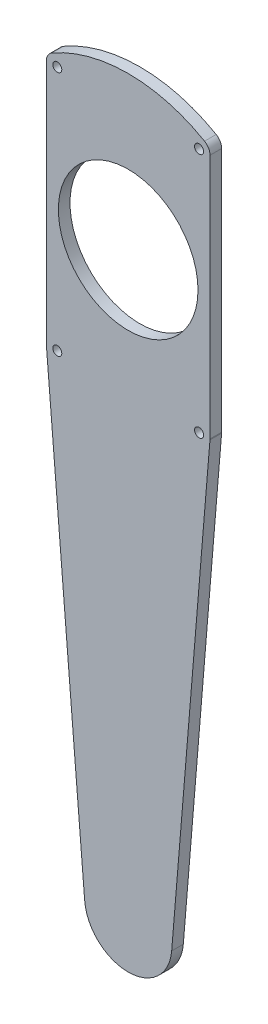
ISO-10303-21;
HEADER;
FILE_DESCRIPTION(('STEP AP214'),'2;1');
FILE_NAME('part.step','',(''),(''),'','','');
FILE_SCHEMA(('AUTOMOTIVE_DESIGN { 1 0 10303 214 1 1 1 1 }'));
ENDSEC;
DATA;
#1=APPLICATION_CONTEXT('core data for automotive mechanical design processes');
#2=APPLICATION_PROTOCOL_DEFINITION('international standard','automotive_design',2000,#1);
#3=PRODUCT_CONTEXT('',#1,'mechanical');
#4=PRODUCT('Part','Part','',(#3));
#5=PRODUCT_RELATED_PRODUCT_CATEGORY('part','',(#4));
#6=PRODUCT_DEFINITION_FORMATION('','',#4);
#7=PRODUCT_DEFINITION_CONTEXT('part definition',#1,'design');
#8=PRODUCT_DEFINITION('design','',#6,#7);
#9=PRODUCT_DEFINITION_SHAPE('','',#8);
#10=(LENGTH_UNIT() NAMED_UNIT(*) SI_UNIT(.MILLI.,.METRE.));
#11=(NAMED_UNIT(*) PLANE_ANGLE_UNIT() SI_UNIT($,.RADIAN.));
#12=(NAMED_UNIT(*) SI_UNIT($,.STERADIAN.) SOLID_ANGLE_UNIT());
#13=UNCERTAINTY_MEASURE_WITH_UNIT(LENGTH_MEASURE(1.E-05),#10,'distance_accuracy_value','');
#14=(GEOMETRIC_REPRESENTATION_CONTEXT(3) GLOBAL_UNCERTAINTY_ASSIGNED_CONTEXT((#13)) GLOBAL_UNIT_ASSIGNED_CONTEXT((#10,
#11,#12)) REPRESENTATION_CONTEXT('',''));
#15=CARTESIAN_POINT('',(0.,0.,0.));
#16=DIRECTION('',(0.,0.,1.));
#17=DIRECTION('',(1.,0.,0.));
#18=AXIS2_PLACEMENT_3D('',#15,#16,#17);
#19=CARTESIAN_POINT('',(-24.375,-42.2187384344914,4.));
#20=DIRECTION('',(0.,0.,-1.));
#21=DIRECTION('',(-1.,0.,0.));
#22=AXIS2_PLACEMENT_3D('',#19,#20,#21);
#23=CYLINDRICAL_SURFACE('',#22,3.74999999999996);
#24=DIRECTION('',(0.,0.,-1.));
#25=VECTOR('',#24,1.);
#26=CARTESIAN_POINT('',(-28.1121679714558,-42.5286990015384,4.));
#27=LINE('',#26,#25);
#28=CARTESIAN_POINT('',(-28.1121679714559,-42.5286990015384,4.));
#29=VERTEX_POINT('',#28);
#30=CARTESIAN_POINT('',(-28.1121679714559,-42.5286990015384,0.));
#31=VERTEX_POINT('',#30);
#32=EDGE_CURVE('E58',#29,#31,#27,.T.);
#33=ORIENTED_EDGE('',*,*,#32,.F.);
#34=CARTESIAN_POINT('',(-24.375,-42.2187384344914,4.));
#35=DIRECTION('',(0.,0.,1.));
#36=DIRECTION('',(1.,0.,0.));
#37=AXIS2_PLACEMENT_3D('',#34,#35,#36);
#38=CIRCLE('',#37,3.74999999999996);
#39=CARTESIAN_POINT('',(-28.125,-42.2187384344914,4.));
#40=VERTEX_POINT('',#39);
#41=EDGE_CURVE('E129',#40,#29,#38,.T.);
#42=ORIENTED_EDGE('',*,*,#41,.F.);
#43=DIRECTION('',(0.,0.,-1.));
#44=VECTOR('',#43,1.);
#45=CARTESIAN_POINT('',(-28.125,-42.2187384344914,4.));
#46=LINE('',#45,#44);
#47=CARTESIAN_POINT('',(-28.125,-42.2187384344914,0.));
#48=VERTEX_POINT('',#47);
#49=EDGE_CURVE('E202',#40,#48,#46,.T.);
#50=ORIENTED_EDGE('',*,*,#49,.T.);
#51=CARTESIAN_POINT('',(-24.375,-42.2187384344914,0.));
#52=DIRECTION('',(0.,0.,1.));
#53=DIRECTION('',(1.,0.,0.));
#54=AXIS2_PLACEMENT_3D('',#51,#52,#53);
#55=CIRCLE('',#54,3.74999999999996);
#56=EDGE_CURVE('E182',#48,#31,#55,.T.);
#57=ORIENTED_EDGE('',*,*,#56,.T.);
#58=EDGE_LOOP('',(#33,#42,#50,#57));
#59=FACE_BOUND('',#58,.T.);
#60=ADVANCED_FACE('F35',(#59),#23,.T.);
#61=CARTESIAN_POINT('',(28.125,0.,4.));
#62=DIRECTION('',(1.,0.,0.));
#63=DIRECTION('',(0.,1.,0.));
#64=AXIS2_PLACEMENT_3D('',#61,#62,#63);
#65=PLANE('',#64);
#66=DIRECTION('',(0.,-1.,0.));
#67=VECTOR('',#66,1.);
#68=CARTESIAN_POINT('',(28.125,0.,0.));
#69=LINE('',#68,#67);
#70=CARTESIAN_POINT('',(28.125,42.2187384344914,0.));
#71=VERTEX_POINT('',#70);
#72=CARTESIAN_POINT('',(28.125,-42.2187384344914,0.));
#73=VERTEX_POINT('',#72);
#74=EDGE_CURVE('E136',#71,#73,#69,.T.);
#75=ORIENTED_EDGE('',*,*,#74,.F.);
#76=DIRECTION('',(0.,0.,-1.));
#77=VECTOR('',#76,1.);
#78=CARTESIAN_POINT('',(28.125,42.2187384344914,4.));
#79=LINE('',#78,#77);
#80=CARTESIAN_POINT('',(28.125,42.2187384344914,4.));
#81=VERTEX_POINT('',#80);
#82=EDGE_CURVE('E11',#81,#71,#79,.T.);
#83=ORIENTED_EDGE('',*,*,#82,.F.);
#84=DIRECTION('',(0.,-1.,0.));
#85=VECTOR('',#84,1.);
#86=CARTESIAN_POINT('',(28.125,0.,4.));
#87=LINE('',#86,#85);
#88=CARTESIAN_POINT('',(28.125,-42.2187384344914,4.));
#89=VERTEX_POINT('',#88);
#90=EDGE_CURVE('E145',#81,#89,#87,.T.);
#91=ORIENTED_EDGE('',*,*,#90,.T.);
#92=DIRECTION('',(0.,0.,-1.));
#93=VECTOR('',#92,1.);
#94=CARTESIAN_POINT('',(28.125,-42.2187384344914,4.));
#95=LINE('',#94,#93);
#96=EDGE_CURVE('E173',#89,#73,#95,.T.);
#97=ORIENTED_EDGE('',*,*,#96,.T.);
#98=EDGE_LOOP('',(#75,#83,#91,#97));
#99=FACE_BOUND('',#98,.T.);
#100=ADVANCED_FACE('F37',(#99),#65,.T.);
#101=CARTESIAN_POINT('',(24.375,42.2187384344914,4.));
#102=DIRECTION('',(0.,0.,-1.));
#103=DIRECTION('',(-1.,0.,0.));
#104=AXIS2_PLACEMENT_3D('',#101,#102,#103);
#105=CYLINDRICAL_SURFACE('',#104,3.74999999999997);
#106=CARTESIAN_POINT('',(24.375,42.2187384344914,0.));
#107=DIRECTION('',(0.,0.,1.));
#108=DIRECTION('',(1.,0.,0.));
#109=AXIS2_PLACEMENT_3D('',#106,#107,#108);
#110=CIRCLE('',#109,3.74999999999997);
#111=CARTESIAN_POINT('',(26.25,45.466333698683,0.));
#112=VERTEX_POINT('',#111);
#113=EDGE_CURVE('E139',#71,#112,#110,.T.);
#114=ORIENTED_EDGE('',*,*,#113,.T.);
#115=DIRECTION('',(0.,0.,-1.));
#116=VECTOR('',#115,1.);
#117=CARTESIAN_POINT('',(26.25,45.466333698683,4.));
#118=LINE('',#117,#116);
#119=CARTESIAN_POINT('',(26.25,45.466333698683,4.));
#120=VERTEX_POINT('',#119);
#121=EDGE_CURVE('E43',#120,#112,#118,.T.);
#122=ORIENTED_EDGE('',*,*,#121,.F.);
#123=CARTESIAN_POINT('',(24.375,42.2187384344914,4.));
#124=DIRECTION('',(0.,0.,1.));
#125=DIRECTION('',(1.,0.,0.));
#126=AXIS2_PLACEMENT_3D('',#123,#124,#125);
#127=CIRCLE('',#126,3.74999999999997);
#128=EDGE_CURVE('E148',#81,#120,#127,.T.);
#129=ORIENTED_EDGE('',*,*,#128,.F.);
#130=ORIENTED_EDGE('',*,*,#82,.T.);
#131=EDGE_LOOP('',(#114,#122,#129,#130));
#132=FACE_BOUND('',#131,.T.);
#133=ADVANCED_FACE('F237',(#132),#105,.T.);
#134=CARTESIAN_POINT('',(0.,0.,4.));
#135=DIRECTION('',(0.,0.,-1.));
#136=DIRECTION('',(-1.,0.,0.));
#137=AXIS2_PLACEMENT_3D('',#134,#135,#136);
#138=CYLINDRICAL_SURFACE('',#137,52.5);
#139=CARTESIAN_POINT('',(0.,0.,0.));
#140=DIRECTION('',(0.,0.,1.));
#141=DIRECTION('',(1.,0.,0.));
#142=AXIS2_PLACEMENT_3D('',#139,#140,#141);
#143=CIRCLE('',#142,52.5);
#144=CARTESIAN_POINT('',(-26.25,45.466333698683,0.));
#145=VERTEX_POINT('',#144);
#146=EDGE_CURVE('E176',#112,#145,#143,.T.);
#147=ORIENTED_EDGE('',*,*,#146,.T.);
#148=DIRECTION('',(0.,0.,-1.));
#149=VECTOR('',#148,1.);
#150=CARTESIAN_POINT('',(-26.25,45.466333698683,4.));
#151=LINE('',#150,#149);
#152=CARTESIAN_POINT('',(-26.25,45.466333698683,4.));
#153=VERTEX_POINT('',#152);
#154=EDGE_CURVE('E208',#153,#145,#151,.T.);
#155=ORIENTED_EDGE('',*,*,#154,.F.);
#156=CARTESIAN_POINT('',(0.,0.,4.));
#157=DIRECTION('',(0.,0.,1.));
#158=DIRECTION('',(1.,0.,0.));
#159=AXIS2_PLACEMENT_3D('',#156,#157,#158);
#160=CIRCLE('',#159,52.5);
#161=EDGE_CURVE('E151',#120,#153,#160,.T.);
#162=ORIENTED_EDGE('',*,*,#161,.F.);
#163=ORIENTED_EDGE('',*,*,#121,.T.);
#164=EDGE_LOOP('',(#147,#155,#162,#163));
#165=FACE_BOUND('',#164,.T.);
#166=ADVANCED_FACE('F215',(#165),#138,.T.);
#167=CARTESIAN_POINT('',(-24.375,42.2187384344914,4.));
#168=DIRECTION('',(0.,0.,-1.));
#169=DIRECTION('',(-1.,0.,0.));
#170=AXIS2_PLACEMENT_3D('',#167,#168,#169);
#171=CYLINDRICAL_SURFACE('',#170,3.75);
#172=CARTESIAN_POINT('',(-24.375,42.2187384344914,0.));
#173=DIRECTION('',(0.,0.,1.));
#174=DIRECTION('',(1.,0.,0.));
#175=AXIS2_PLACEMENT_3D('',#172,#173,#174);
#176=CIRCLE('',#175,3.75);
#177=CARTESIAN_POINT('',(-28.125,42.2187384344914,0.));
#178=VERTEX_POINT('',#177);
#179=EDGE_CURVE('E178',#145,#178,#176,.T.);
#180=ORIENTED_EDGE('',*,*,#179,.T.);
#181=DIRECTION('',(0.,0.,-1.));
#182=VECTOR('',#181,1.);
#183=CARTESIAN_POINT('',(-28.125,42.2187384344914,4.));
#184=LINE('',#183,#182);
#185=CARTESIAN_POINT('',(-28.125,42.2187384344914,4.));
#186=VERTEX_POINT('',#185);
#187=EDGE_CURVE('E205',#186,#178,#184,.T.);
#188=ORIENTED_EDGE('',*,*,#187,.F.);
#189=CARTESIAN_POINT('',(-24.375,42.2187384344914,4.));
#190=DIRECTION('',(0.,0.,1.));
#191=DIRECTION('',(1.,0.,0.));
#192=AXIS2_PLACEMENT_3D('',#189,#190,#191);
#193=CIRCLE('',#192,3.75);
#194=EDGE_CURVE('E153',#153,#186,#193,.T.);
#195=ORIENTED_EDGE('',*,*,#194,.F.);
#196=ORIENTED_EDGE('',*,*,#154,.T.);
#197=EDGE_LOOP('',(#180,#188,#195,#196));
#198=FACE_BOUND('',#197,.T.);
#199=ADVANCED_FACE('F230',(#198),#171,.T.);
#200=CARTESIAN_POINT('',(-28.125,0.,4.));
#201=DIRECTION('',(1.,0.,0.));
#202=DIRECTION('',(0.,1.,0.));
#203=AXIS2_PLACEMENT_3D('',#200,#201,#202);
#204=PLANE('',#203);
#205=DIRECTION('',(0.,-1.,0.));
#206=VECTOR('',#205,1.);
#207=CARTESIAN_POINT('',(-28.125,0.,0.));
#208=LINE('',#207,#206);
#209=EDGE_CURVE('E180',#178,#48,#208,.T.);
#210=ORIENTED_EDGE('',*,*,#209,.T.);
#211=ORIENTED_EDGE('',*,*,#49,.F.);
#212=DIRECTION('',(0.,-1.,0.));
#213=VECTOR('',#212,1.);
#214=CARTESIAN_POINT('',(-28.125,0.,4.));
#215=LINE('',#214,#213);
#216=EDGE_CURVE('E155',#186,#40,#215,.T.);
#217=ORIENTED_EDGE('',*,*,#216,.F.);
#218=ORIENTED_EDGE('',*,*,#187,.T.);
#219=EDGE_LOOP('',(#210,#211,#217,#218));
#220=FACE_BOUND('',#219,.T.);
#221=ADVANCED_FACE('F234',(#220),#204,.F.);
#222=CARTESIAN_POINT('',(24.375,-42.2187384344914,4.));
#223=DIRECTION('',(0.,0.,-1.));
#224=DIRECTION('',(-1.,0.,0.));
#225=AXIS2_PLACEMENT_3D('',#222,#223,#224);
#226=CYLINDRICAL_SURFACE('',#225,1.54999999999999);
#227=CARTESIAN_POINT('',(24.375,-42.2187384344914,4.));
#228=DIRECTION('',(0.,0.,1.));
#229=DIRECTION('',(1.,0.,0.));
#230=AXIS2_PLACEMENT_3D('',#227,#228,#229);
#231=CIRCLE('',#230,1.54999999999999);
#232=CARTESIAN_POINT('',(25.925,-42.2187384344914,4.));
#233=VERTEX_POINT('',#232);
#234=EDGE_CURVE('E168',#233,#233,#231,.T.);
#235=ORIENTED_EDGE('',*,*,#234,.T.);
#236=EDGE_LOOP('',(#235));
#237=FACE_BOUND('',#236,.T.);
#238=CARTESIAN_POINT('',(24.375,-42.2187384344914,0.));
#239=DIRECTION('',(0.,0.,1.));
#240=DIRECTION('',(1.,0.,0.));
#241=AXIS2_PLACEMENT_3D('',#238,#239,#240);
#242=CIRCLE('',#241,1.54999999999999);
#243=CARTESIAN_POINT('',(25.925,-42.2187384344914,0.));
#244=VERTEX_POINT('',#243);
#245=EDGE_CURVE('E195',#244,#244,#242,.T.);
#246=ORIENTED_EDGE('',*,*,#245,.F.);
#247=EDGE_LOOP('',(#246));
#248=FACE_BOUND('',#247,.T.);
#249=ADVANCED_FACE('F270',(#237,#248),#226,.F.);
#250=CARTESIAN_POINT('',(24.375,42.2187384344914,4.));
#251=DIRECTION('',(0.,0.,-1.));
#252=DIRECTION('',(-1.,0.,0.));
#253=AXIS2_PLACEMENT_3D('',#250,#251,#252);
#254=CYLINDRICAL_SURFACE('',#253,1.55);
#255=CARTESIAN_POINT('',(24.375,42.2187384344914,4.));
#256=DIRECTION('',(0.,0.,1.));
#257=DIRECTION('',(1.,0.,0.));
#258=AXIS2_PLACEMENT_3D('',#255,#256,#257);
#259=CIRCLE('',#258,1.55);
#260=CARTESIAN_POINT('',(25.925,42.2187384344914,4.));
#261=VERTEX_POINT('',#260);
#262=EDGE_CURVE('E165',#261,#261,#259,.T.);
#263=ORIENTED_EDGE('',*,*,#262,.T.);
#264=EDGE_LOOP('',(#263));
#265=FACE_BOUND('',#264,.T.);
#266=CARTESIAN_POINT('',(24.375,42.2187384344914,0.));
#267=DIRECTION('',(0.,0.,1.));
#268=DIRECTION('',(1.,0.,0.));
#269=AXIS2_PLACEMENT_3D('',#266,#267,#268);
#270=CIRCLE('',#269,1.55);
#271=CARTESIAN_POINT('',(25.925,42.2187384344914,0.));
#272=VERTEX_POINT('',#271);
#273=EDGE_CURVE('E192',#272,#272,#270,.T.);
#274=ORIENTED_EDGE('',*,*,#273,.F.);
#275=EDGE_LOOP('',(#274));
#276=FACE_BOUND('',#275,.T.);
#277=ADVANCED_FACE('F297',(#265,#276),#254,.F.);
#278=CARTESIAN_POINT('',(-24.375,42.2187384344914,4.));
#279=DIRECTION('',(0.,0.,-1.));
#280=DIRECTION('',(-1.,0.,0.));
#281=AXIS2_PLACEMENT_3D('',#278,#279,#280);
#282=CYLINDRICAL_SURFACE('',#281,1.54999999999999);
#283=CARTESIAN_POINT('',(-24.375,42.2187384344914,4.));
#284=DIRECTION('',(0.,0.,1.));
#285=DIRECTION('',(1.,0.,0.));
#286=AXIS2_PLACEMENT_3D('',#283,#284,#285);
#287=CIRCLE('',#286,1.54999999999999);
#288=CARTESIAN_POINT('',(-22.825,42.2187384344914,4.));
#289=VERTEX_POINT('',#288);
#290=EDGE_CURVE('E162',#289,#289,#287,.T.);
#291=ORIENTED_EDGE('',*,*,#290,.T.);
#292=EDGE_LOOP('',(#291));
#293=FACE_BOUND('',#292,.T.);
#294=CARTESIAN_POINT('',(-24.375,42.2187384344914,0.));
#295=DIRECTION('',(0.,0.,1.));
#296=DIRECTION('',(1.,0.,0.));
#297=AXIS2_PLACEMENT_3D('',#294,#295,#296);
#298=CIRCLE('',#297,1.54999999999999);
#299=CARTESIAN_POINT('',(-22.825,42.2187384344914,0.));
#300=VERTEX_POINT('',#299);
#301=EDGE_CURVE('E189',#300,#300,#298,.T.);
#302=ORIENTED_EDGE('',*,*,#301,.F.);
#303=EDGE_LOOP('',(#302));
#304=FACE_BOUND('',#303,.T.);
#305=ADVANCED_FACE('F259',(#293,#304),#282,.F.);
#306=CARTESIAN_POINT('',(0.,0.,4.));
#307=DIRECTION('',(0.,0.,-1.));
#308=DIRECTION('',(-1.,0.,0.));
#309=AXIS2_PLACEMENT_3D('',#306,#307,#308);
#310=CYLINDRICAL_SURFACE('',#309,24.);
#311=CARTESIAN_POINT('',(0.,0.,4.));
#312=DIRECTION('',(0.,0.,1.));
#313=DIRECTION('',(1.,0.,0.));
#314=AXIS2_PLACEMENT_3D('',#311,#312,#313);
#315=CIRCLE('',#314,24.);
#316=CARTESIAN_POINT('',(24.,0.,4.));
#317=VERTEX_POINT('',#316);
#318=EDGE_CURVE('E159',#317,#317,#315,.T.);
#319=ORIENTED_EDGE('',*,*,#318,.T.);
#320=EDGE_LOOP('',(#319));
#321=FACE_BOUND('',#320,.T.);
#322=CARTESIAN_POINT('',(0.,0.,0.));
#323=DIRECTION('',(0.,0.,1.));
#324=DIRECTION('',(1.,0.,0.));
#325=AXIS2_PLACEMENT_3D('',#322,#323,#324);
#326=CIRCLE('',#325,24.);
#327=CARTESIAN_POINT('',(24.,0.,0.));
#328=VERTEX_POINT('',#327);
#329=EDGE_CURVE('E186',#328,#328,#326,.T.);
#330=ORIENTED_EDGE('',*,*,#329,.F.);
#331=EDGE_LOOP('',(#330));
#332=FACE_BOUND('',#331,.T.);
#333=ADVANCED_FACE('F251',(#321,#332),#310,.F.);
#334=CARTESIAN_POINT('',(24.375,-42.2187384344914,4.));
#335=DIRECTION('',(0.,0.,-1.));
#336=DIRECTION('',(-1.,0.,0.));
#337=AXIS2_PLACEMENT_3D('',#334,#335,#336);
#338=CYLINDRICAL_SURFACE('',#337,3.74999999999996);
#339=CARTESIAN_POINT('',(24.375,-42.2187384344914,4.));
#340=DIRECTION('',(0.,0.,1.));
#341=DIRECTION('',(1.,0.,0.));
#342=AXIS2_PLACEMENT_3D('',#339,#340,#341);
#343=CIRCLE('',#342,3.74999999999996);
#344=CARTESIAN_POINT('',(28.1121679714559,-42.5286990015384,4.));
#345=VERTEX_POINT('',#344);
#346=EDGE_CURVE('E50',#345,#89,#343,.T.);
#347=ORIENTED_EDGE('',*,*,#346,.F.);
#348=DIRECTION('',(0.,0.,-1.));
#349=VECTOR('',#348,1.);
#350=CARTESIAN_POINT('',(28.1121679714558,-42.5286990015384,4.));
#351=LINE('',#350,#349);
#352=CARTESIAN_POINT('',(28.1121679714559,-42.5286990015384,0.));
#353=VERTEX_POINT('',#352);
#354=EDGE_CURVE('E141',#345,#353,#351,.T.);
#355=ORIENTED_EDGE('',*,*,#354,.T.);
#356=CARTESIAN_POINT('',(24.375,-42.2187384344914,0.));
#357=DIRECTION('',(0.,0.,1.));
#358=DIRECTION('',(1.,0.,0.));
#359=AXIS2_PLACEMENT_3D('',#356,#357,#358);
#360=CIRCLE('',#359,3.74999999999996);
#361=EDGE_CURVE('E184',#353,#73,#360,.T.);
#362=ORIENTED_EDGE('',*,*,#361,.T.);
#363=ORIENTED_EDGE('',*,*,#96,.F.);
#364=EDGE_LOOP('',(#347,#355,#362,#363));
#365=FACE_BOUND('',#364,.T.);
#366=ADVANCED_FACE('F248',(#365),#338,.T.);
#367=CARTESIAN_POINT('',(-24.375,-42.2187384344914,4.));
#368=DIRECTION('',(0.,0.,-1.));
#369=DIRECTION('',(-1.,0.,0.));
#370=AXIS2_PLACEMENT_3D('',#367,#368,#369);
#371=CYLINDRICAL_SURFACE('',#370,1.55);
#372=CARTESIAN_POINT('',(-24.375,-42.2187384344914,4.));
#373=DIRECTION('',(0.,0.,1.));
#374=DIRECTION('',(1.,0.,0.));
#375=AXIS2_PLACEMENT_3D('',#372,#373,#374);
#376=CIRCLE('',#375,1.55);
#377=CARTESIAN_POINT('',(-22.825,-42.2187384344914,4.));
#378=VERTEX_POINT('',#377);
#379=EDGE_CURVE('E171',#378,#378,#376,.T.);
#380=ORIENTED_EDGE('',*,*,#379,.T.);
#381=EDGE_LOOP('',(#380));
#382=FACE_BOUND('',#381,.T.);
#383=CARTESIAN_POINT('',(-24.375,-42.2187384344914,0.));
#384=DIRECTION('',(0.,0.,1.));
#385=DIRECTION('',(1.,0.,0.));
#386=AXIS2_PLACEMENT_3D('',#383,#384,#385);
#387=CIRCLE('',#386,1.55);
#388=CARTESIAN_POINT('',(-22.825,-42.2187384344914,0.));
#389=VERTEX_POINT('',#388);
#390=EDGE_CURVE('E149',#389,#389,#387,.T.);
#391=ORIENTED_EDGE('',*,*,#390,.F.);
#392=EDGE_LOOP('',(#391));
#393=FACE_BOUND('',#392,.T.);
#394=ADVANCED_FACE('F250',(#382,#393),#371,.F.);
#395=CARTESIAN_POINT('',(0.,0.,4.));
#396=DIRECTION('',(0.,0.,1.));
#397=DIRECTION('',(1.,0.,0.));
#398=AXIS2_PLACEMENT_3D('',#395,#396,#397);
#399=PLANE('',#398);
#400=DIRECTION('',(-0.0826561512125357,-0.996578125721577,0.));
#401=VECTOR('',#400,1.);
#402=CARTESIAN_POINT('',(31.4233343367733,-2.60625013484195,4.));
#403=LINE('',#402,#401);
#404=CARTESIAN_POINT('',(14.9486718858237,-201.239842268188,4.));
#405=VERTEX_POINT('',#404);
#406=EDGE_CURVE('E123',#345,#405,#403,.T.);
#407=ORIENTED_EDGE('',*,*,#406,.F.);
#408=ORIENTED_EDGE('',*,*,#346,.T.);
#409=ORIENTED_EDGE('',*,*,#90,.F.);
#410=ORIENTED_EDGE('',*,*,#128,.T.);
#411=ORIENTED_EDGE('',*,*,#161,.T.);
#412=ORIENTED_EDGE('',*,*,#194,.T.);
#413=ORIENTED_EDGE('',*,*,#216,.T.);
#414=ORIENTED_EDGE('',*,*,#41,.T.);
#415=DIRECTION('',(0.0826561512125357,-0.996578125721577,0.));
#416=VECTOR('',#415,1.);
#417=CARTESIAN_POINT('',(-31.4233343367733,-2.60625013484195,4.));
#418=LINE('',#417,#416);
#419=CARTESIAN_POINT('',(-14.9486718858237,-201.239842268188,4.));
#420=VERTEX_POINT('',#419);
#421=EDGE_CURVE('E124',#29,#420,#418,.T.);
#422=ORIENTED_EDGE('',*,*,#421,.T.);
#423=CARTESIAN_POINT('',(0.,-200.,4.));
#424=DIRECTION('',(0.,0.,1.));
#425=DIRECTION('',(1.,0.,0.));
#426=AXIS2_PLACEMENT_3D('',#423,#424,#425);
#427=CIRCLE('',#426,15.);
#428=EDGE_CURVE('E112',#420,#405,#427,.T.);
#429=ORIENTED_EDGE('',*,*,#428,.T.);
#430=EDGE_LOOP('',(#407,#408,#409,#410,#411,#412,#413,#414,#422,#429));
#431=FACE_BOUND('',#430,.T.);
#432=ORIENTED_EDGE('',*,*,#318,.F.);
#433=EDGE_LOOP('',(#432));
#434=FACE_BOUND('',#433,.T.);
#435=ORIENTED_EDGE('',*,*,#290,.F.);
#436=EDGE_LOOP('',(#435));
#437=FACE_BOUND('',#436,.T.);
#438=ORIENTED_EDGE('',*,*,#262,.F.);
#439=EDGE_LOOP('',(#438));
#440=FACE_BOUND('',#439,.T.);
#441=ORIENTED_EDGE('',*,*,#234,.F.);
#442=EDGE_LOOP('',(#441));
#443=FACE_BOUND('',#442,.T.);
#444=ORIENTED_EDGE('',*,*,#379,.F.);
#445=EDGE_LOOP('',(#444));
#446=FACE_BOUND('',#445,.T.);
#447=ADVANCED_FACE('F127',(#431,#434,#437,#440,#443,#446),#399,.T.);
#448=CARTESIAN_POINT('',(0.,0.,0.));
#449=DIRECTION('',(0.,0.,1.));
#450=DIRECTION('',(1.,0.,0.));
#451=AXIS2_PLACEMENT_3D('',#448,#449,#450);
#452=PLANE('',#451);
#453=ORIENTED_EDGE('',*,*,#361,.F.);
#454=DIRECTION('',(-0.0826561512125357,-0.996578125721577,0.));
#455=VECTOR('',#454,1.);
#456=CARTESIAN_POINT('',(31.4233343367733,-2.60625013484195,0.));
#457=LINE('',#456,#455);
#458=CARTESIAN_POINT('',(14.9486718858237,-201.239842268188,0.));
#459=VERTEX_POINT('',#458);
#460=EDGE_CURVE('E131',#353,#459,#457,.T.);
#461=ORIENTED_EDGE('',*,*,#460,.T.);
#462=CARTESIAN_POINT('',(0.,-200.,0.));
#463=DIRECTION('',(0.,0.,1.));
#464=DIRECTION('',(1.,0.,0.));
#465=AXIS2_PLACEMENT_3D('',#462,#463,#464);
#466=CIRCLE('',#465,15.);
#467=CARTESIAN_POINT('',(-14.9486718858237,-201.239842268188,0.));
#468=VERTEX_POINT('',#467);
#469=EDGE_CURVE('E243',#468,#459,#466,.T.);
#470=ORIENTED_EDGE('',*,*,#469,.F.);
#471=DIRECTION('',(0.0826561512125357,-0.996578125721577,0.));
#472=VECTOR('',#471,1.);
#473=CARTESIAN_POINT('',(-31.4233343367733,-2.60625013484195,0.));
#474=LINE('',#473,#472);
#475=EDGE_CURVE('E135',#31,#468,#474,.T.);
#476=ORIENTED_EDGE('',*,*,#475,.F.);
#477=ORIENTED_EDGE('',*,*,#56,.F.);
#478=ORIENTED_EDGE('',*,*,#209,.F.);
#479=ORIENTED_EDGE('',*,*,#179,.F.);
#480=ORIENTED_EDGE('',*,*,#146,.F.);
#481=ORIENTED_EDGE('',*,*,#113,.F.);
#482=ORIENTED_EDGE('',*,*,#74,.T.);
#483=EDGE_LOOP('',(#453,#461,#470,#476,#477,#478,#479,#480,#481,#482));
#484=FACE_BOUND('',#483,.T.);
#485=ORIENTED_EDGE('',*,*,#329,.T.);
#486=EDGE_LOOP('',(#485));
#487=FACE_BOUND('',#486,.T.);
#488=ORIENTED_EDGE('',*,*,#301,.T.);
#489=EDGE_LOOP('',(#488));
#490=FACE_BOUND('',#489,.T.);
#491=ORIENTED_EDGE('',*,*,#273,.T.);
#492=EDGE_LOOP('',(#491));
#493=FACE_BOUND('',#492,.T.);
#494=ORIENTED_EDGE('',*,*,#245,.T.);
#495=EDGE_LOOP('',(#494));
#496=FACE_BOUND('',#495,.T.);
#497=ORIENTED_EDGE('',*,*,#390,.T.);
#498=EDGE_LOOP('',(#497));
#499=FACE_BOUND('',#498,.T.);
#500=ADVANCED_FACE('F223',(#484,#487,#490,#493,#496,#499),#452,.F.);
#501=CARTESIAN_POINT('',(-31.4233343367733,-2.60625013484195,4.));
#502=DIRECTION('',(0.996578125721577,0.0826561512125357,0.));
#503=DIRECTION('',(-0.0826561512125357,0.996578125721577,0.));
#504=AXIS2_PLACEMENT_3D('',#501,#502,#503);
#505=PLANE('',#504);
#506=ORIENTED_EDGE('',*,*,#475,.T.);
#507=DIRECTION('',(0.,0.,-1.));
#508=VECTOR('',#507,1.);
#509=CARTESIAN_POINT('',(-14.9486718858237,-201.239842268188,4.));
#510=LINE('',#509,#508);
#511=EDGE_CURVE('E117',#420,#468,#510,.T.);
#512=ORIENTED_EDGE('',*,*,#511,.F.);
#513=ORIENTED_EDGE('',*,*,#421,.F.);
#514=ORIENTED_EDGE('',*,*,#32,.T.);
#515=EDGE_LOOP('',(#506,#512,#513,#514));
#516=FACE_BOUND('',#515,.T.);
#517=ADVANCED_FACE('F133',(#516),#505,.F.);
#518=CARTESIAN_POINT('',(0.,-200.,4.));
#519=DIRECTION('',(0.,0.,-1.));
#520=DIRECTION('',(-1.,0.,0.));
#521=AXIS2_PLACEMENT_3D('',#518,#519,#520);
#522=CYLINDRICAL_SURFACE('',#521,15.);
#523=ORIENTED_EDGE('',*,*,#469,.T.);
#524=DIRECTION('',(0.,0.,-1.));
#525=VECTOR('',#524,1.);
#526=CARTESIAN_POINT('',(14.9486718858237,-201.239842268188,4.));
#527=LINE('',#526,#525);
#528=EDGE_CURVE('E119',#405,#459,#527,.T.);
#529=ORIENTED_EDGE('',*,*,#528,.F.);
#530=ORIENTED_EDGE('',*,*,#428,.F.);
#531=ORIENTED_EDGE('',*,*,#511,.T.);
#532=EDGE_LOOP('',(#523,#529,#530,#531));
#533=FACE_BOUND('',#532,.T.);
#534=ADVANCED_FACE('F115',(#533),#522,.T.);
#535=CARTESIAN_POINT('',(31.4233343367733,-2.60625013484195,4.));
#536=DIRECTION('',(0.996578125721577,-0.0826561512125357,0.));
#537=DIRECTION('',(0.0826561512125357,0.996578125721577,0.));
#538=AXIS2_PLACEMENT_3D('',#535,#536,#537);
#539=PLANE('',#538);
#540=ORIENTED_EDGE('',*,*,#460,.F.);
#541=ORIENTED_EDGE('',*,*,#354,.F.);
#542=ORIENTED_EDGE('',*,*,#406,.T.);
#543=ORIENTED_EDGE('',*,*,#528,.T.);
#544=EDGE_LOOP('',(#540,#541,#542,#543));
#545=FACE_BOUND('',#544,.T.);
#546=ADVANCED_FACE('F242',(#545),#539,.T.);
#547=CLOSED_SHELL('',(#60,#100,#133,#166,#199,#221,#249,#277,#305,#333,#366,#394,#447,#500,#517,
#534,#546));
#548=MANIFOLD_SOLID_BREP('B2',#547);
#549=ADVANCED_BREP_SHAPE_REPRESENTATION('',(#18,#548),#14);
#550=SHAPE_DEFINITION_REPRESENTATION(#9,#549);
ENDSEC;
END-ISO-10303-21;
